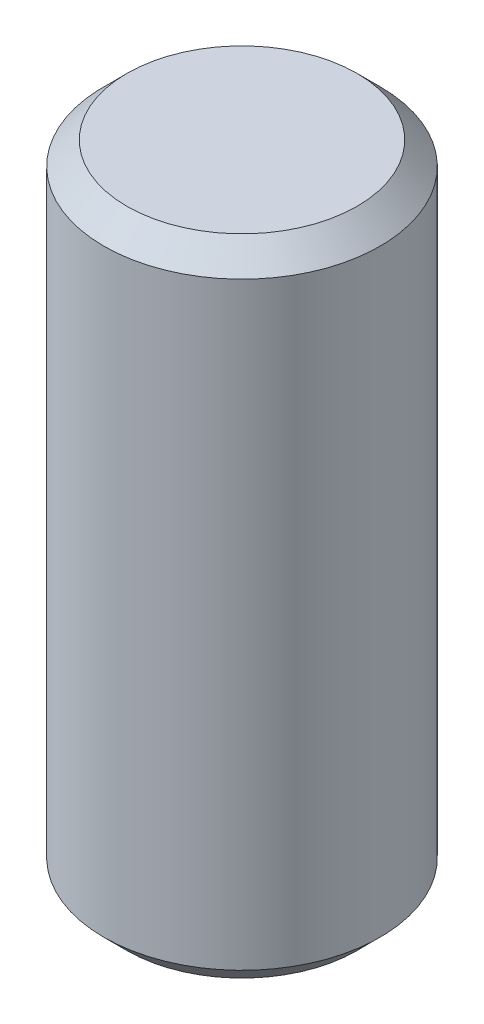
ISO-10303-21;
HEADER;
FILE_DESCRIPTION(('STEP AP214'),'2;1');
FILE_NAME('part.step','',(''),(''),'','','');
FILE_SCHEMA(('AUTOMOTIVE_DESIGN { 1 0 10303 214 1 1 1 1 }'));
ENDSEC;
DATA;
#1=APPLICATION_CONTEXT('core data for automotive mechanical design processes');
#2=APPLICATION_PROTOCOL_DEFINITION('international standard','automotive_design',2000,#1);
#3=PRODUCT_CONTEXT('',#1,'mechanical');
#4=PRODUCT('Part','Part','',(#3));
#5=PRODUCT_RELATED_PRODUCT_CATEGORY('part','',(#4));
#6=PRODUCT_DEFINITION_FORMATION('','',#4);
#7=PRODUCT_DEFINITION_CONTEXT('part definition',#1,'design');
#8=PRODUCT_DEFINITION('design','',#6,#7);
#9=PRODUCT_DEFINITION_SHAPE('','',#8);
#10=(LENGTH_UNIT() NAMED_UNIT(*) SI_UNIT(.MILLI.,.METRE.));
#11=(NAMED_UNIT(*) PLANE_ANGLE_UNIT() SI_UNIT($,.RADIAN.));
#12=(NAMED_UNIT(*) SI_UNIT($,.STERADIAN.) SOLID_ANGLE_UNIT());
#13=UNCERTAINTY_MEASURE_WITH_UNIT(LENGTH_MEASURE(1.E-05),#10,'distance_accuracy_value','');
#14=(GEOMETRIC_REPRESENTATION_CONTEXT(3) GLOBAL_UNCERTAINTY_ASSIGNED_CONTEXT((#13)) GLOBAL_UNIT_ASSIGNED_CONTEXT((#10,
#11,#12)) REPRESENTATION_CONTEXT('',''));
#15=CARTESIAN_POINT('',(0.,0.,0.));
#16=DIRECTION('',(0.,0.,1.));
#17=DIRECTION('',(1.,0.,0.));
#18=AXIS2_PLACEMENT_3D('',#15,#16,#17);
#19=CARTESIAN_POINT('',(0.,-2.50833333333333,-1.));
#20=DIRECTION('',(0.,-1.,0.));
#21=DIRECTION('',(0.,0.,1.));
#22=AXIS2_PLACEMENT_3D('',#19,#20,#21);
#23=PLANE('',#22);
#24=CARTESIAN_POINT('',(0.,-2.50833333333333,0.));
#25=DIRECTION('',(0.,-1.,0.));
#26=DIRECTION('',(0.,0.,-1.));
#27=AXIS2_PLACEMENT_3D('',#24,#25,#26);
#28=CIRCLE('',#27,1.);
#29=CARTESIAN_POINT('',(0.,-2.50833333333333,-1.));
#30=VERTEX_POINT('',#29);
#31=EDGE_CURVE('E11',#30,#30,#28,.T.);
#32=ORIENTED_EDGE('',*,*,#31,.T.);
#33=EDGE_LOOP('',(#32));
#34=FACE_BOUND('',#33,.T.);
#35=ADVANCED_FACE('F39',(#34),#23,.T.);
#36=CARTESIAN_POINT('',(0.,3.825,0.));
#37=DIRECTION('',(0.,1.,0.));
#38=DIRECTION('',(0.,0.,-1.));
#39=AXIS2_PLACEMENT_3D('',#36,#37,#38);
#40=CYLINDRICAL_SURFACE('',#39,1.);
#41=ORIENTED_EDGE('',*,*,#31,.F.);
#42=EDGE_LOOP('',(#41));
#43=FACE_BOUND('',#42,.T.);
#44=CARTESIAN_POINT('',(0.,-3.175,0.));
#45=DIRECTION('',(0.,-1.,0.));
#46=DIRECTION('',(0.,0.,-1.));
#47=AXIS2_PLACEMENT_3D('',#44,#45,#46);
#48=CIRCLE('',#47,1.);
#49=CARTESIAN_POINT('',(0.,-3.175,-1.));
#50=VERTEX_POINT('',#49);
#51=EDGE_CURVE('E45',#50,#50,#48,.T.);
#52=ORIENTED_EDGE('',*,*,#51,.T.);
#53=EDGE_LOOP('',(#52));
#54=FACE_BOUND('',#53,.T.);
#55=ADVANCED_FACE('F77',(#43,#54),#40,.F.);
#56=CARTESIAN_POINT('',(0.,-3.175,-1.25));
#57=DIRECTION('',(0.,-1.,0.));
#58=DIRECTION('',(0.,0.,1.));
#59=AXIS2_PLACEMENT_3D('',#56,#57,#58);
#60=PLANE('',#59);
#61=ORIENTED_EDGE('',*,*,#51,.F.);
#62=EDGE_LOOP('',(#61));
#63=FACE_BOUND('',#62,.T.);
#64=CARTESIAN_POINT('',(0.,-3.175,0.));
#65=DIRECTION('',(0.,-1.,0.));
#66=DIRECTION('',(0.,0.,-1.));
#67=AXIS2_PLACEMENT_3D('',#64,#65,#66);
#68=CIRCLE('',#67,1.25);
#69=CARTESIAN_POINT('',(0.,-3.175,-1.25));
#70=VERTEX_POINT('',#69);
#71=EDGE_CURVE('E49',#70,#70,#68,.T.);
#72=ORIENTED_EDGE('',*,*,#71,.T.);
#73=EDGE_LOOP('',(#72));
#74=FACE_BOUND('',#73,.T.);
#75=ADVANCED_FACE('F81',(#63,#74),#60,.T.);
#76=CARTESIAN_POINT('',(0.,-2.925,0.));
#77=DIRECTION('',(0.,1.,0.));
#78=DIRECTION('',(0.,0.,-1.));
#79=AXIS2_PLACEMENT_3D('',#76,#77,#78);
#80=CONICAL_SURFACE('',#79,1.5,0.785398163397449);
#81=ORIENTED_EDGE('',*,*,#71,.F.);
#82=EDGE_LOOP('',(#81));
#83=FACE_BOUND('',#82,.T.);
#84=CARTESIAN_POINT('',(0.,-2.925,0.));
#85=DIRECTION('',(0.,-1.,0.));
#86=DIRECTION('',(0.,0.,-1.));
#87=AXIS2_PLACEMENT_3D('',#84,#85,#86);
#88=CIRCLE('',#87,1.5);
#89=CARTESIAN_POINT('',(0.,-2.925,-1.5));
#90=VERTEX_POINT('',#89);
#91=EDGE_CURVE('E53',#90,#90,#88,.T.);
#92=ORIENTED_EDGE('',*,*,#91,.T.);
#93=EDGE_LOOP('',(#92));
#94=FACE_BOUND('',#93,.T.);
#95=ADVANCED_FACE('F86',(#83,#94),#80,.T.);
#96=CARTESIAN_POINT('',(0.,3.825,0.));
#97=DIRECTION('',(0.,1.,0.));
#98=DIRECTION('',(0.,0.,-1.));
#99=AXIS2_PLACEMENT_3D('',#96,#97,#98);
#100=CYLINDRICAL_SURFACE('',#99,1.5);
#101=ORIENTED_EDGE('',*,*,#91,.F.);
#102=EDGE_LOOP('',(#101));
#103=FACE_BOUND('',#102,.T.);
#104=CARTESIAN_POINT('',(0.,3.575,0.));
#105=DIRECTION('',(0.,-1.,0.));
#106=DIRECTION('',(0.,0.,-1.));
#107=AXIS2_PLACEMENT_3D('',#104,#105,#106);
#108=CIRCLE('',#107,1.5);
#109=CARTESIAN_POINT('',(0.,3.575,-1.5));
#110=VERTEX_POINT('',#109);
#111=EDGE_CURVE('E58',#110,#110,#108,.T.);
#112=ORIENTED_EDGE('',*,*,#111,.T.);
#113=EDGE_LOOP('',(#112));
#114=FACE_BOUND('',#113,.T.);
#115=ADVANCED_FACE('F73',(#103,#114),#100,.T.);
#116=CARTESIAN_POINT('',(0.,3.825,0.));
#117=DIRECTION('',(0.,-1.,0.));
#118=DIRECTION('',(0.,0.,1.));
#119=AXIS2_PLACEMENT_3D('',#116,#117,#118);
#120=CONICAL_SURFACE('',#119,1.25,0.78539816339745);
#121=ORIENTED_EDGE('',*,*,#111,.F.);
#122=EDGE_LOOP('',(#121));
#123=FACE_BOUND('',#122,.T.);
#124=CARTESIAN_POINT('',(0.,3.825,0.));
#125=DIRECTION('',(0.,-1.,0.));
#126=DIRECTION('',(0.,0.,-1.));
#127=AXIS2_PLACEMENT_3D('',#124,#125,#126);
#128=CIRCLE('',#127,1.25);
#129=CARTESIAN_POINT('',(0.,3.825,-1.25));
#130=VERTEX_POINT('',#129);
#131=EDGE_CURVE('E61',#130,#130,#128,.T.);
#132=ORIENTED_EDGE('',*,*,#131,.T.);
#133=EDGE_LOOP('',(#132));
#134=FACE_BOUND('',#133,.T.);
#135=ADVANCED_FACE('F65',(#123,#134),#120,.T.);
#136=CARTESIAN_POINT('',(0.,3.825,-1.25));
#137=DIRECTION('',(0.,1.,0.));
#138=DIRECTION('',(0.,0.,-1.));
#139=AXIS2_PLACEMENT_3D('',#136,#137,#138);
#140=PLANE('',#139);
#141=ORIENTED_EDGE('',*,*,#131,.F.);
#142=EDGE_LOOP('',(#141));
#143=FACE_BOUND('',#142,.T.);
#144=ADVANCED_FACE('F67',(#143),#140,.T.);
#145=CLOSED_SHELL('',(#35,#55,#75,#95,#115,#135,#144));
#146=MANIFOLD_SOLID_BREP('B2',#145);
#147=CARTESIAN_POINT('',(0.,-2.825,0.));
#148=DIRECTION('',(0.,-1.,0.));
#149=DIRECTION('',(0.,0.,1.));
#150=AXIS2_PLACEMENT_3D('',#147,#148,#149);
#151=SPHERICAL_SURFACE('',#150,1.);
#152=CARTESIAN_POINT('',(0.,-3.825,0.));
#153=VERTEX_POINT('',#152);
#154=VERTEX_LOOP('',#153);
#155=FACE_BOUND('',#154,.T.);
#156=ADVANCED_FACE('F140',(#155),#151,.T.);
#157=CLOSED_SHELL('',(#156));
#158=MANIFOLD_SOLID_BREP('B6',#157);
#159=ADVANCED_BREP_SHAPE_REPRESENTATION('',(#18,#146,#158),#14);
#160=SHAPE_DEFINITION_REPRESENTATION(#9,#159);
ENDSEC;
END-ISO-10303-21;
